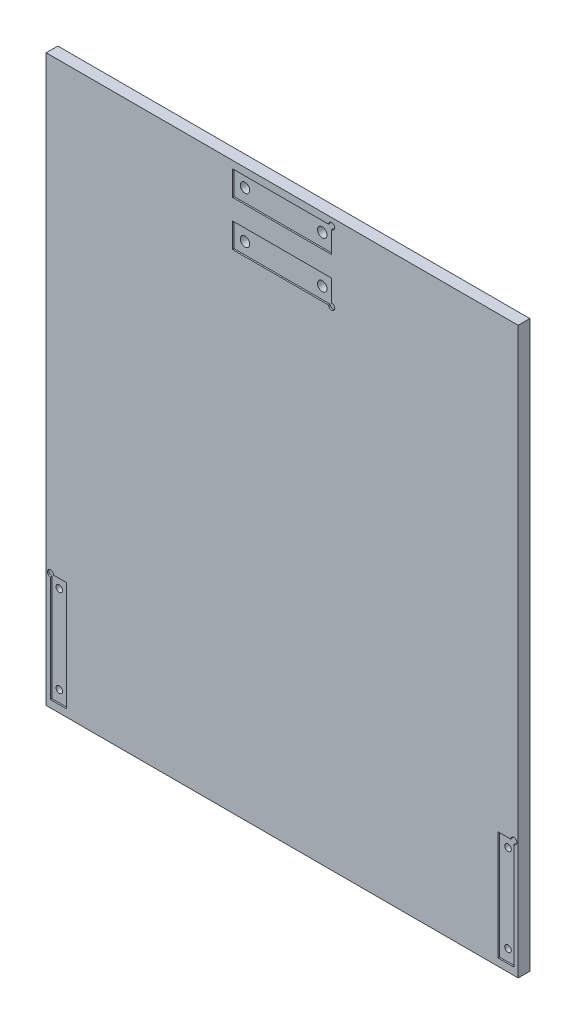
ISO-10303-21;
HEADER;
FILE_DESCRIPTION(('STEP AP214'),'2;1');
FILE_NAME('part.step','',(''),(''),'','','');
FILE_SCHEMA(('AUTOMOTIVE_DESIGN { 1 0 10303 214 1 1 1 1 }'));
ENDSEC;
DATA;
#1=APPLICATION_CONTEXT('core data for automotive mechanical design processes');
#2=APPLICATION_PROTOCOL_DEFINITION('international standard','automotive_design',2000,#1);
#3=PRODUCT_CONTEXT('',#1,'mechanical');
#4=PRODUCT('Part','Part','',(#3));
#5=PRODUCT_RELATED_PRODUCT_CATEGORY('part','',(#4));
#6=PRODUCT_DEFINITION_FORMATION('','',#4);
#7=PRODUCT_DEFINITION_CONTEXT('part definition',#1,'design');
#8=PRODUCT_DEFINITION('design','',#6,#7);
#9=PRODUCT_DEFINITION_SHAPE('','',#8);
#10=(LENGTH_UNIT() NAMED_UNIT(*) SI_UNIT(.MILLI.,.METRE.));
#11=(NAMED_UNIT(*) PLANE_ANGLE_UNIT() SI_UNIT($,.RADIAN.));
#12=(NAMED_UNIT(*) SI_UNIT($,.STERADIAN.) SOLID_ANGLE_UNIT());
#13=UNCERTAINTY_MEASURE_WITH_UNIT(LENGTH_MEASURE(1.E-05),#10,'distance_accuracy_value','');
#14=(GEOMETRIC_REPRESENTATION_CONTEXT(3) GLOBAL_UNCERTAINTY_ASSIGNED_CONTEXT((#13)) GLOBAL_UNIT_ASSIGNED_CONTEXT((#10,
#11,#12)) REPRESENTATION_CONTEXT('',''));
#15=CARTESIAN_POINT('',(0.,0.,0.));
#16=DIRECTION('',(0.,0.,1.));
#17=DIRECTION('',(1.,0.,0.));
#18=AXIS2_PLACEMENT_3D('',#15,#16,#17);
#19=CARTESIAN_POINT('',(0.,0.,8.));
#20=DIRECTION('',(0.,0.,1.));
#21=DIRECTION('',(1.,0.,0.));
#22=AXIS2_PLACEMENT_3D('',#19,#20,#21);
#23=PLANE('',#22);
#24=DIRECTION('',(0.,1.,0.));
#25=VECTOR('',#24,1.);
#26=CARTESIAN_POINT('',(34.,186.9,8.));
#27=LINE('',#26,#25);
#28=CARTESIAN_POINT('',(34.,172.,8.));
#29=VERTEX_POINT('',#28);
#30=CARTESIAN_POINT('',(34.,186.9,8.));
#31=VERTEX_POINT('',#30);
#32=EDGE_CURVE('E51',#29,#31,#27,.T.);
#33=ORIENTED_EDGE('',*,*,#32,.F.);
#34=DIRECTION('',(1.,0.,0.));
#35=VECTOR('',#34,1.);
#36=CARTESIAN_POINT('',(-34.,172.,8.));
#37=LINE('',#36,#35);
#38=CARTESIAN_POINT('',(-34.,172.,8.));
#39=VERTEX_POINT('',#38);
#40=EDGE_CURVE('E218',#39,#29,#37,.T.);
#41=ORIENTED_EDGE('',*,*,#40,.F.);
#42=DIRECTION('',(0.,-1.,0.));
#43=VECTOR('',#42,1.);
#44=CARTESIAN_POINT('',(-34.,189.,8.));
#45=LINE('',#44,#43);
#46=CARTESIAN_POINT('',(-34.,189.,8.));
#47=VERTEX_POINT('',#46);
#48=EDGE_CURVE('E221',#47,#39,#45,.T.);
#49=ORIENTED_EDGE('',*,*,#48,.F.);
#50=DIRECTION('',(-1.,0.,0.));
#51=VECTOR('',#50,1.);
#52=CARTESIAN_POINT('',(-34.,189.,8.));
#53=LINE('',#52,#51);
#54=CARTESIAN_POINT('',(31.9,189.,8.));
#55=VERTEX_POINT('',#54);
#56=EDGE_CURVE('E234',#55,#47,#53,.T.);
#57=ORIENTED_EDGE('',*,*,#56,.F.);
#58=CARTESIAN_POINT('',(34.,189.,8.));
#59=DIRECTION('',(0.,0.,1.));
#60=DIRECTION('',(-1.,0.,0.));
#61=AXIS2_PLACEMENT_3D('',#58,#59,#60);
#62=CIRCLE('',#61,2.09999999999999);
#63=EDGE_CURVE('E232',#31,#55,#62,.T.);
#64=ORIENTED_EDGE('',*,*,#63,.F.);
#65=EDGE_LOOP('',(#33,#41,#49,#57,#64));
#66=FACE_BOUND('',#65,.T.);
#67=DIRECTION('',(0.,-1.,0.));
#68=VECTOR('',#67,1.);
#69=CARTESIAN_POINT('',(-34.,141.,8.));
#70=LINE('',#69,#68);
#71=CARTESIAN_POINT('',(-34.,158.,8.));
#72=VERTEX_POINT('',#71);
#73=CARTESIAN_POINT('',(-34.,141.,8.));
#74=VERTEX_POINT('',#73);
#75=EDGE_CURVE('E59',#72,#74,#70,.T.);
#76=ORIENTED_EDGE('',*,*,#75,.F.);
#77=DIRECTION('',(-1.,0.,0.));
#78=VECTOR('',#77,1.);
#79=CARTESIAN_POINT('',(-34.,158.,8.));
#80=LINE('',#79,#78);
#81=CARTESIAN_POINT('',(34.,158.,8.));
#82=VERTEX_POINT('',#81);
#83=EDGE_CURVE('E259',#82,#72,#80,.T.);
#84=ORIENTED_EDGE('',*,*,#83,.F.);
#85=DIRECTION('',(0.,1.,0.));
#86=VECTOR('',#85,1.);
#87=CARTESIAN_POINT('',(34.,143.1,8.));
#88=LINE('',#87,#86);
#89=CARTESIAN_POINT('',(34.,143.1,8.));
#90=VERTEX_POINT('',#89);
#91=EDGE_CURVE('E262',#90,#82,#88,.T.);
#92=ORIENTED_EDGE('',*,*,#91,.F.);
#93=CARTESIAN_POINT('',(34.,141.,8.));
#94=DIRECTION('',(0.,0.,1.));
#95=DIRECTION('',(1.,0.,0.));
#96=AXIS2_PLACEMENT_3D('',#93,#94,#95);
#97=CIRCLE('',#96,2.09999999999999);
#98=CARTESIAN_POINT('',(31.9,141.,8.));
#99=VERTEX_POINT('',#98);
#100=EDGE_CURVE('E266',#99,#90,#97,.T.);
#101=ORIENTED_EDGE('',*,*,#100,.F.);
#102=DIRECTION('',(1.,0.,0.));
#103=VECTOR('',#102,1.);
#104=CARTESIAN_POINT('',(-34.,141.,8.));
#105=LINE('',#104,#103);
#106=EDGE_CURVE('E269',#74,#99,#105,.T.);
#107=ORIENTED_EDGE('',*,*,#106,.F.);
#108=EDGE_LOOP('',(#76,#84,#92,#101,#107));
#109=FACE_BOUND('',#108,.T.);
#110=DIRECTION('',(0.,1.,0.));
#111=VECTOR('',#110,1.);
#112=CARTESIAN_POINT('',(159.,-116.1,8.));
#113=LINE('',#112,#111);
#114=CARTESIAN_POINT('',(159.,-189.,8.));
#115=VERTEX_POINT('',#114);
#116=CARTESIAN_POINT('',(159.,-116.1,8.));
#117=VERTEX_POINT('',#116);
#118=EDGE_CURVE('E339',#115,#117,#113,.T.);
#119=ORIENTED_EDGE('',*,*,#118,.F.);
#120=DIRECTION('',(1.,0.,0.));
#121=VECTOR('',#120,1.);
#122=CARTESIAN_POINT('',(148.,-189.,8.));
#123=LINE('',#122,#121);
#124=CARTESIAN_POINT('',(148.,-189.,8.));
#125=VERTEX_POINT('',#124);
#126=EDGE_CURVE('E352',#125,#115,#123,.T.);
#127=ORIENTED_EDGE('',*,*,#126,.F.);
#128=DIRECTION('',(0.,-1.,0.));
#129=VECTOR('',#128,1.);
#130=CARTESIAN_POINT('',(148.,-114.,8.));
#131=LINE('',#130,#129);
#132=CARTESIAN_POINT('',(148.,-114.,8.));
#133=VERTEX_POINT('',#132);
#134=EDGE_CURVE('E372',#133,#125,#131,.T.);
#135=ORIENTED_EDGE('',*,*,#134,.F.);
#136=DIRECTION('',(-1.,0.,0.));
#137=VECTOR('',#136,1.);
#138=CARTESIAN_POINT('',(148.,-114.,8.));
#139=LINE('',#138,#137);
#140=CARTESIAN_POINT('',(156.9,-114.,8.));
#141=VERTEX_POINT('',#140);
#142=EDGE_CURVE('E369',#141,#133,#139,.T.);
#143=ORIENTED_EDGE('',*,*,#142,.F.);
#144=CARTESIAN_POINT('',(159.,-114.,8.));
#145=DIRECTION('',(0.,0.,1.));
#146=DIRECTION('',(-1.,0.,0.));
#147=AXIS2_PLACEMENT_3D('',#144,#145,#146);
#148=CIRCLE('',#147,2.1);
#149=EDGE_CURVE('E366',#117,#141,#148,.T.);
#150=ORIENTED_EDGE('',*,*,#149,.F.);
#151=EDGE_LOOP('',(#119,#127,#135,#143,#150));
#152=FACE_BOUND('',#151,.T.);
#153=DIRECTION('',(0.,1.,0.));
#154=VECTOR('',#153,1.);
#155=CARTESIAN_POINT('',(162.,194.,8.));
#156=LINE('',#155,#154);
#157=CARTESIAN_POINT('',(162.,-194.,8.));
#158=VERTEX_POINT('',#157);
#159=CARTESIAN_POINT('',(162.,194.,8.));
#160=VERTEX_POINT('',#159);
#161=EDGE_CURVE('E388',#158,#160,#156,.T.);
#162=ORIENTED_EDGE('',*,*,#161,.T.);
#163=DIRECTION('',(-1.,0.,0.));
#164=VECTOR('',#163,1.);
#165=CARTESIAN_POINT('',(-162.,194.,8.));
#166=LINE('',#165,#164);
#167=CARTESIAN_POINT('',(-162.,194.,8.));
#168=VERTEX_POINT('',#167);
#169=EDGE_CURVE('E391',#160,#168,#166,.T.);
#170=ORIENTED_EDGE('',*,*,#169,.T.);
#171=DIRECTION('',(0.,-1.,0.));
#172=VECTOR('',#171,1.);
#173=CARTESIAN_POINT('',(-162.,194.,8.));
#174=LINE('',#173,#172);
#175=CARTESIAN_POINT('',(-162.,-194.,8.));
#176=VERTEX_POINT('',#175);
#177=EDGE_CURVE('E394',#168,#176,#174,.T.);
#178=ORIENTED_EDGE('',*,*,#177,.T.);
#179=DIRECTION('',(1.,0.,0.));
#180=VECTOR('',#179,1.);
#181=CARTESIAN_POINT('',(-162.,-194.,8.));
#182=LINE('',#181,#180);
#183=EDGE_CURVE('E396',#176,#158,#182,.T.);
#184=ORIENTED_EDGE('',*,*,#183,.T.);
#185=EDGE_LOOP('',(#162,#170,#178,#184));
#186=FACE_BOUND('',#185,.T.);
#187=DIRECTION('',(-1.,0.,0.));
#188=VECTOR('',#187,1.);
#189=CARTESIAN_POINT('',(-148.,-189.,8.));
#190=LINE('',#189,#188);
#191=CARTESIAN_POINT('',(-148.,-189.,8.));
#192=VERTEX_POINT('',#191);
#193=CARTESIAN_POINT('',(-159.,-189.,8.));
#194=VERTEX_POINT('',#193);
#195=EDGE_CURVE('E325',#192,#194,#190,.T.);
#196=ORIENTED_EDGE('',*,*,#195,.T.);
#197=DIRECTION('',(0.,1.,0.));
#198=VECTOR('',#197,1.);
#199=CARTESIAN_POINT('',(-159.,-116.1,8.));
#200=LINE('',#199,#198);
#201=CARTESIAN_POINT('',(-159.,-116.1,8.));
#202=VERTEX_POINT('',#201);
#203=EDGE_CURVE('E301',#194,#202,#200,.T.);
#204=ORIENTED_EDGE('',*,*,#203,.T.);
#205=CARTESIAN_POINT('',(-159.,-114.,8.));
#206=DIRECTION('',(0.,0.,-1.));
#207=DIRECTION('',(1.,0.,0.));
#208=AXIS2_PLACEMENT_3D('',#205,#206,#207);
#209=CIRCLE('',#208,2.1);
#210=CARTESIAN_POINT('',(-156.9,-114.,8.));
#211=VERTEX_POINT('',#210);
#212=EDGE_CURVE('E314',#202,#211,#209,.T.);
#213=ORIENTED_EDGE('',*,*,#212,.T.);
#214=DIRECTION('',(1.,0.,0.));
#215=VECTOR('',#214,1.);
#216=CARTESIAN_POINT('',(-148.,-114.,8.));
#217=LINE('',#216,#215);
#218=CARTESIAN_POINT('',(-148.,-114.,8.));
#219=VERTEX_POINT('',#218);
#220=EDGE_CURVE('E331',#211,#219,#217,.T.);
#221=ORIENTED_EDGE('',*,*,#220,.T.);
#222=DIRECTION('',(0.,-1.,0.));
#223=VECTOR('',#222,1.);
#224=CARTESIAN_POINT('',(-148.,-114.,8.));
#225=LINE('',#224,#223);
#226=EDGE_CURVE('E328',#219,#192,#225,.T.);
#227=ORIENTED_EDGE('',*,*,#226,.T.);
#228=EDGE_LOOP('',(#196,#204,#213,#221,#227));
#229=FACE_BOUND('',#228,.T.);
#230=ADVANCED_FACE('F36',(#66,#109,#152,#186,#229),#23,.T.);
#231=CARTESIAN_POINT('',(162.,194.,8.));
#232=DIRECTION('',(-1.,0.,0.));
#233=DIRECTION('',(0.,-1.,0.));
#234=AXIS2_PLACEMENT_3D('',#231,#232,#233);
#235=PLANE('',#234);
#236=DIRECTION('',(0.,1.,0.));
#237=VECTOR('',#236,1.);
#238=CARTESIAN_POINT('',(162.,194.,0.));
#239=LINE('',#238,#237);
#240=CARTESIAN_POINT('',(162.,-194.,0.));
#241=VERTEX_POINT('',#240);
#242=CARTESIAN_POINT('',(162.,194.,0.));
#243=VERTEX_POINT('',#242);
#244=EDGE_CURVE('E379',#241,#243,#239,.T.);
#245=ORIENTED_EDGE('',*,*,#244,.T.);
#246=DIRECTION('',(0.,0.,-1.));
#247=VECTOR('',#246,1.);
#248=CARTESIAN_POINT('',(162.,194.,8.));
#249=LINE('',#248,#247);
#250=EDGE_CURVE('E11',#160,#243,#249,.T.);
#251=ORIENTED_EDGE('',*,*,#250,.F.);
#252=ORIENTED_EDGE('',*,*,#161,.F.);
#253=DIRECTION('',(0.,0.,-1.));
#254=VECTOR('',#253,1.);
#255=CARTESIAN_POINT('',(162.,-194.,8.));
#256=LINE('',#255,#254);
#257=EDGE_CURVE('E398',#158,#241,#256,.T.);
#258=ORIENTED_EDGE('',*,*,#257,.T.);
#259=EDGE_LOOP('',(#245,#251,#252,#258));
#260=FACE_BOUND('',#259,.T.);
#261=ADVANCED_FACE('F38',(#260),#235,.F.);
#262=CARTESIAN_POINT('',(-162.,194.,8.));
#263=DIRECTION('',(0.,-1.,0.));
#264=DIRECTION('',(0.,0.,-1.));
#265=AXIS2_PLACEMENT_3D('',#262,#263,#264);
#266=PLANE('',#265);
#267=DIRECTION('',(-1.,0.,0.));
#268=VECTOR('',#267,1.);
#269=CARTESIAN_POINT('',(-162.,194.,0.));
#270=LINE('',#269,#268);
#271=CARTESIAN_POINT('',(-162.,194.,0.));
#272=VERTEX_POINT('',#271);
#273=EDGE_CURVE('E401',#243,#272,#270,.T.);
#274=ORIENTED_EDGE('',*,*,#273,.T.);
#275=DIRECTION('',(0.,0.,-1.));
#276=VECTOR('',#275,1.);
#277=CARTESIAN_POINT('',(-162.,194.,8.));
#278=LINE('',#277,#276);
#279=EDGE_CURVE('E44',#168,#272,#278,.T.);
#280=ORIENTED_EDGE('',*,*,#279,.F.);
#281=ORIENTED_EDGE('',*,*,#169,.F.);
#282=ORIENTED_EDGE('',*,*,#250,.T.);
#283=EDGE_LOOP('',(#274,#280,#281,#282));
#284=FACE_BOUND('',#283,.T.);
#285=ADVANCED_FACE('F431',(#284),#266,.F.);
#286=CARTESIAN_POINT('',(-162.,194.,8.));
#287=DIRECTION('',(1.,0.,0.));
#288=DIRECTION('',(0.,1.,0.));
#289=AXIS2_PLACEMENT_3D('',#286,#287,#288);
#290=PLANE('',#289);
#291=DIRECTION('',(0.,-1.,0.));
#292=VECTOR('',#291,1.);
#293=CARTESIAN_POINT('',(-162.,194.,0.));
#294=LINE('',#293,#292);
#295=CARTESIAN_POINT('',(-162.,-194.,0.));
#296=VERTEX_POINT('',#295);
#297=EDGE_CURVE('E403',#272,#296,#294,.T.);
#298=ORIENTED_EDGE('',*,*,#297,.T.);
#299=DIRECTION('',(0.,0.,-1.));
#300=VECTOR('',#299,1.);
#301=CARTESIAN_POINT('',(-162.,-194.,8.));
#302=LINE('',#301,#300);
#303=EDGE_CURVE('E408',#176,#296,#302,.T.);
#304=ORIENTED_EDGE('',*,*,#303,.F.);
#305=ORIENTED_EDGE('',*,*,#177,.F.);
#306=ORIENTED_EDGE('',*,*,#279,.T.);
#307=EDGE_LOOP('',(#298,#304,#305,#306));
#308=FACE_BOUND('',#307,.T.);
#309=ADVANCED_FACE('F415',(#308),#290,.F.);
#310=CARTESIAN_POINT('',(-162.,-194.,8.));
#311=DIRECTION('',(0.,1.,0.));
#312=DIRECTION('',(0.,0.,1.));
#313=AXIS2_PLACEMENT_3D('',#310,#311,#312);
#314=PLANE('',#313);
#315=DIRECTION('',(1.,0.,0.));
#316=VECTOR('',#315,1.);
#317=CARTESIAN_POINT('',(-162.,-194.,0.));
#318=LINE('',#317,#316);
#319=EDGE_CURVE('E392',#296,#241,#318,.T.);
#320=ORIENTED_EDGE('',*,*,#319,.T.);
#321=ORIENTED_EDGE('',*,*,#257,.F.);
#322=ORIENTED_EDGE('',*,*,#183,.F.);
#323=ORIENTED_EDGE('',*,*,#303,.T.);
#324=EDGE_LOOP('',(#320,#321,#322,#323));
#325=FACE_BOUND('',#324,.T.);
#326=ADVANCED_FACE('F424',(#325),#314,.F.);
#327=CARTESIAN_POINT('',(0.,0.,0.));
#328=DIRECTION('',(0.,0.,1.));
#329=DIRECTION('',(1.,0.,0.));
#330=AXIS2_PLACEMENT_3D('',#327,#328,#329);
#331=PLANE('',#330);
#332=CARTESIAN_POINT('',(-26.5,149.,0.));
#333=DIRECTION('',(0.,0.,1.));
#334=DIRECTION('',(-1.,0.,0.));
#335=AXIS2_PLACEMENT_3D('',#332,#333,#334);
#336=CIRCLE('',#335,3.25);
#337=CARTESIAN_POINT('',(-29.75,149.,0.));
#338=VERTEX_POINT('',#337);
#339=EDGE_CURVE('E874',#338,#338,#336,.T.);
#340=ORIENTED_EDGE('',*,*,#339,.T.);
#341=EDGE_LOOP('',(#340));
#342=FACE_BOUND('',#341,.T.);
#343=CARTESIAN_POINT('',(26.5,149.,0.));
#344=DIRECTION('',(0.,0.,1.));
#345=DIRECTION('',(1.,0.,0.));
#346=AXIS2_PLACEMENT_3D('',#343,#344,#345);
#347=CIRCLE('',#346,3.24999999999998);
#348=CARTESIAN_POINT('',(29.75,149.,0.));
#349=VERTEX_POINT('',#348);
#350=EDGE_CURVE('E878',#349,#349,#347,.T.);
#351=ORIENTED_EDGE('',*,*,#350,.T.);
#352=EDGE_LOOP('',(#351));
#353=FACE_BOUND('',#352,.T.);
#354=CARTESIAN_POINT('',(26.5,181.,0.));
#355=DIRECTION('',(0.,0.,1.));
#356=DIRECTION('',(-1.,0.,0.));
#357=AXIS2_PLACEMENT_3D('',#354,#355,#356);
#358=CIRCLE('',#357,3.25);
#359=CARTESIAN_POINT('',(23.25,181.,0.));
#360=VERTEX_POINT('',#359);
#361=EDGE_CURVE('E893',#360,#360,#358,.T.);
#362=ORIENTED_EDGE('',*,*,#361,.T.);
#363=EDGE_LOOP('',(#362));
#364=FACE_BOUND('',#363,.T.);
#365=CARTESIAN_POINT('',(-26.5,181.,0.));
#366=DIRECTION('',(0.,0.,1.));
#367=DIRECTION('',(1.,0.,0.));
#368=AXIS2_PLACEMENT_3D('',#365,#366,#367);
#369=CIRCLE('',#368,3.25);
#370=CARTESIAN_POINT('',(-23.25,181.,0.));
#371=VERTEX_POINT('',#370);
#372=EDGE_CURVE('E258',#371,#371,#369,.T.);
#373=ORIENTED_EDGE('',*,*,#372,.T.);
#374=EDGE_LOOP('',(#373));
#375=FACE_BOUND('',#374,.T.);
#376=CARTESIAN_POINT('',(-154.,-121.,0.));
#377=DIRECTION('',(0.,0.,-1.));
#378=DIRECTION('',(-1.,0.,0.));
#379=AXIS2_PLACEMENT_3D('',#376,#377,#378);
#380=CIRCLE('',#379,2.25000000000001);
#381=CARTESIAN_POINT('',(-156.25,-121.,0.));
#382=VERTEX_POINT('',#381);
#383=EDGE_CURVE('E286',#382,#382,#380,.T.);
#384=ORIENTED_EDGE('',*,*,#383,.F.);
#385=EDGE_LOOP('',(#384));
#386=FACE_BOUND('',#385,.T.);
#387=CARTESIAN_POINT('',(-153.999999999998,-181.000000000001,0.));
#388=DIRECTION('',(0.,0.,-1.));
#389=DIRECTION('',(1.,0.,0.));
#390=AXIS2_PLACEMENT_3D('',#387,#388,#389);
#391=CIRCLE('',#390,2.25000000000254);
#392=CARTESIAN_POINT('',(-151.749999999995,-181.000000000001,0.));
#393=VERTEX_POINT('',#392);
#394=EDGE_CURVE('E293',#393,#393,#391,.T.);
#395=ORIENTED_EDGE('',*,*,#394,.F.);
#396=EDGE_LOOP('',(#395));
#397=FACE_BOUND('',#396,.T.);
#398=CARTESIAN_POINT('',(154.,-121.,0.));
#399=DIRECTION('',(0.,0.,1.));
#400=DIRECTION('',(1.,0.,0.));
#401=AXIS2_PLACEMENT_3D('',#398,#399,#400);
#402=CIRCLE('',#401,2.25000000000001);
#403=CARTESIAN_POINT('',(156.25,-121.,0.));
#404=VERTEX_POINT('',#403);
#405=EDGE_CURVE('E298',#404,#404,#402,.T.);
#406=ORIENTED_EDGE('',*,*,#405,.T.);
#407=EDGE_LOOP('',(#406));
#408=FACE_BOUND('',#407,.T.);
#409=CARTESIAN_POINT('',(153.999999999998,-181.000000000001,0.));
#410=DIRECTION('',(0.,0.,1.));
#411=DIRECTION('',(-1.,0.,0.));
#412=AXIS2_PLACEMENT_3D('',#409,#410,#411);
#413=CIRCLE('',#412,2.25000000000254);
#414=CARTESIAN_POINT('',(151.749999999995,-181.000000000001,0.));
#415=VERTEX_POINT('',#414);
#416=EDGE_CURVE('E289',#415,#415,#413,.T.);
#417=ORIENTED_EDGE('',*,*,#416,.T.);
#418=EDGE_LOOP('',(#417));
#419=FACE_BOUND('',#418,.T.);
#420=ORIENTED_EDGE('',*,*,#244,.F.);
#421=ORIENTED_EDGE('',*,*,#319,.F.);
#422=ORIENTED_EDGE('',*,*,#297,.F.);
#423=ORIENTED_EDGE('',*,*,#273,.F.);
#424=EDGE_LOOP('',(#420,#421,#422,#423));
#425=FACE_BOUND('',#424,.T.);
#426=ADVANCED_FACE('F421',(#342,#353,#364,#375,#386,#397,#408,#419,#425),#331,.F.);
#427=CARTESIAN_POINT('',(159.,-116.1,7.));
#428=DIRECTION('',(1.,0.,0.));
#429=DIRECTION('',(0.,1.,0.));
#430=AXIS2_PLACEMENT_3D('',#427,#428,#429);
#431=PLANE('',#430);
#432=ORIENTED_EDGE('',*,*,#118,.T.);
#433=DIRECTION('',(0.,0.,1.));
#434=VECTOR('',#433,1.);
#435=CARTESIAN_POINT('',(159.,-116.1,7.));
#436=LINE('',#435,#434);
#437=CARTESIAN_POINT('',(159.,-116.1,7.));
#438=VERTEX_POINT('',#437);
#439=EDGE_CURVE('E364',#438,#117,#436,.T.);
#440=ORIENTED_EDGE('',*,*,#439,.F.);
#441=DIRECTION('',(0.,1.,0.));
#442=VECTOR('',#441,1.);
#443=CARTESIAN_POINT('',(159.,-116.1,7.));
#444=LINE('',#443,#442);
#445=CARTESIAN_POINT('',(159.,-189.,7.));
#446=VERTEX_POINT('',#445);
#447=EDGE_CURVE('E348',#446,#438,#444,.T.);
#448=ORIENTED_EDGE('',*,*,#447,.F.);
#449=DIRECTION('',(0.,0.,1.));
#450=VECTOR('',#449,1.);
#451=CARTESIAN_POINT('',(159.,-189.,7.));
#452=LINE('',#451,#450);
#453=EDGE_CURVE('E377',#446,#115,#452,.T.);
#454=ORIENTED_EDGE('',*,*,#453,.T.);
#455=EDGE_LOOP('',(#432,#440,#448,#454));
#456=FACE_BOUND('',#455,.T.);
#457=ADVANCED_FACE('F446',(#456),#431,.F.);
#458=CARTESIAN_POINT('',(148.,-189.,7.));
#459=DIRECTION('',(0.,-1.,0.));
#460=DIRECTION('',(0.,0.,-1.));
#461=AXIS2_PLACEMENT_3D('',#458,#459,#460);
#462=PLANE('',#461);
#463=ORIENTED_EDGE('',*,*,#126,.T.);
#464=ORIENTED_EDGE('',*,*,#453,.F.);
#465=DIRECTION('',(1.,0.,0.));
#466=VECTOR('',#465,1.);
#467=CARTESIAN_POINT('',(148.,-189.,7.));
#468=LINE('',#467,#466);
#469=CARTESIAN_POINT('',(148.,-189.,7.));
#470=VERTEX_POINT('',#469);
#471=EDGE_CURVE('E361',#470,#446,#468,.T.);
#472=ORIENTED_EDGE('',*,*,#471,.F.);
#473=DIRECTION('',(0.,0.,1.));
#474=VECTOR('',#473,1.);
#475=CARTESIAN_POINT('',(148.,-189.,7.));
#476=LINE('',#475,#474);
#477=EDGE_CURVE('E380',#470,#125,#476,.T.);
#478=ORIENTED_EDGE('',*,*,#477,.T.);
#479=EDGE_LOOP('',(#463,#464,#472,#478));
#480=FACE_BOUND('',#479,.T.);
#481=ADVANCED_FACE('F468',(#480),#462,.F.);
#482=CARTESIAN_POINT('',(148.,-114.,7.));
#483=DIRECTION('',(-1.,0.,0.));
#484=DIRECTION('',(0.,0.,1.));
#485=AXIS2_PLACEMENT_3D('',#482,#483,#484);
#486=PLANE('',#485);
#487=ORIENTED_EDGE('',*,*,#134,.T.);
#488=ORIENTED_EDGE('',*,*,#477,.F.);
#489=DIRECTION('',(0.,-1.,0.));
#490=VECTOR('',#489,1.);
#491=CARTESIAN_POINT('',(148.,-114.,7.));
#492=LINE('',#491,#490);
#493=CARTESIAN_POINT('',(148.,-114.,7.));
#494=VERTEX_POINT('',#493);
#495=EDGE_CURVE('E358',#494,#470,#492,.T.);
#496=ORIENTED_EDGE('',*,*,#495,.F.);
#497=DIRECTION('',(0.,0.,1.));
#498=VECTOR('',#497,1.);
#499=CARTESIAN_POINT('',(148.,-114.,7.));
#500=LINE('',#499,#498);
#501=EDGE_CURVE('E382',#494,#133,#500,.T.);
#502=ORIENTED_EDGE('',*,*,#501,.T.);
#503=EDGE_LOOP('',(#487,#488,#496,#502));
#504=FACE_BOUND('',#503,.T.);
#505=ADVANCED_FACE('F475',(#504),#486,.F.);
#506=CARTESIAN_POINT('',(148.,-114.,7.));
#507=DIRECTION('',(0.,1.,0.));
#508=DIRECTION('',(0.,0.,1.));
#509=AXIS2_PLACEMENT_3D('',#506,#507,#508);
#510=PLANE('',#509);
#511=ORIENTED_EDGE('',*,*,#142,.T.);
#512=ORIENTED_EDGE('',*,*,#501,.F.);
#513=DIRECTION('',(-1.,0.,0.));
#514=VECTOR('',#513,1.);
#515=CARTESIAN_POINT('',(148.,-114.,7.));
#516=LINE('',#515,#514);
#517=CARTESIAN_POINT('',(156.9,-114.,7.));
#518=VERTEX_POINT('',#517);
#519=EDGE_CURVE('E355',#518,#494,#516,.T.);
#520=ORIENTED_EDGE('',*,*,#519,.F.);
#521=DIRECTION('',(0.,0.,1.));
#522=VECTOR('',#521,1.);
#523=CARTESIAN_POINT('',(156.9,-114.,7.));
#524=LINE('',#523,#522);
#525=EDGE_CURVE('E384',#518,#141,#524,.T.);
#526=ORIENTED_EDGE('',*,*,#525,.T.);
#527=EDGE_LOOP('',(#511,#512,#520,#526));
#528=FACE_BOUND('',#527,.T.);
#529=ADVANCED_FACE('F483',(#528),#510,.F.);
#530=CARTESIAN_POINT('',(159.,-114.,7.));
#531=DIRECTION('',(0.,0.,1.));
#532=DIRECTION('',(1.,0.,0.));
#533=AXIS2_PLACEMENT_3D('',#530,#531,#532);
#534=CYLINDRICAL_SURFACE('',#533,2.1);
#535=ORIENTED_EDGE('',*,*,#149,.T.);
#536=ORIENTED_EDGE('',*,*,#525,.F.);
#537=CARTESIAN_POINT('',(159.,-114.,7.));
#538=DIRECTION('',(0.,0.,1.));
#539=DIRECTION('',(-1.,0.,0.));
#540=AXIS2_PLACEMENT_3D('',#537,#538,#539);
#541=CIRCLE('',#540,2.1);
#542=EDGE_CURVE('E351',#438,#518,#541,.T.);
#543=ORIENTED_EDGE('',*,*,#542,.F.);
#544=ORIENTED_EDGE('',*,*,#439,.T.);
#545=EDGE_LOOP('',(#535,#536,#543,#544));
#546=FACE_BOUND('',#545,.T.);
#547=ADVANCED_FACE('F491',(#546),#534,.F.);
#548=CARTESIAN_POINT('',(159.,-114.,7.));
#549=DIRECTION('',(0.,0.,-1.));
#550=DIRECTION('',(-1.,0.,0.));
#551=AXIS2_PLACEMENT_3D('',#548,#549,#550);
#552=PLANE('',#551);
#553=CARTESIAN_POINT('',(154.,-121.,7.));
#554=DIRECTION('',(0.,0.,1.));
#555=DIRECTION('',(1.,0.,0.));
#556=AXIS2_PLACEMENT_3D('',#553,#554,#555);
#557=CIRCLE('',#556,2.25000000000001);
#558=CARTESIAN_POINT('',(156.25,-121.,7.));
#559=VERTEX_POINT('',#558);
#560=EDGE_CURVE('E302',#559,#559,#557,.T.);
#561=ORIENTED_EDGE('',*,*,#560,.F.);
#562=EDGE_LOOP('',(#561));
#563=FACE_BOUND('',#562,.T.);
#564=CARTESIAN_POINT('',(153.999999999998,-181.000000000001,7.));
#565=DIRECTION('',(0.,0.,1.));
#566=DIRECTION('',(-1.,0.,0.));
#567=AXIS2_PLACEMENT_3D('',#564,#565,#566);
#568=CIRCLE('',#567,2.25000000000254);
#569=CARTESIAN_POINT('',(151.749999999995,-181.000000000001,7.));
#570=VERTEX_POINT('',#569);
#571=EDGE_CURVE('E305',#570,#570,#568,.T.);
#572=ORIENTED_EDGE('',*,*,#571,.F.);
#573=EDGE_LOOP('',(#572));
#574=FACE_BOUND('',#573,.T.);
#575=ORIENTED_EDGE('',*,*,#447,.T.);
#576=ORIENTED_EDGE('',*,*,#542,.T.);
#577=ORIENTED_EDGE('',*,*,#519,.T.);
#578=ORIENTED_EDGE('',*,*,#495,.T.);
#579=ORIENTED_EDGE('',*,*,#471,.T.);
#580=EDGE_LOOP('',(#575,#576,#577,#578,#579));
#581=FACE_BOUND('',#580,.T.);
#582=ADVANCED_FACE('F499',(#563,#574,#581),#552,.F.);
#583=CARTESIAN_POINT('',(-159.,-116.1,7.));
#584=DIRECTION('',(1.,0.,0.));
#585=DIRECTION('',(0.,1.,0.));
#586=AXIS2_PLACEMENT_3D('',#583,#584,#585);
#587=PLANE('',#586);
#588=ORIENTED_EDGE('',*,*,#203,.F.);
#589=DIRECTION('',(0.,0.,1.));
#590=VECTOR('',#589,1.);
#591=CARTESIAN_POINT('',(-159.,-189.,7.));
#592=LINE('',#591,#590);
#593=CARTESIAN_POINT('',(-159.,-189.,7.));
#594=VERTEX_POINT('',#593);
#595=EDGE_CURVE('E322',#594,#194,#592,.T.);
#596=ORIENTED_EDGE('',*,*,#595,.F.);
#597=DIRECTION('',(0.,1.,0.));
#598=VECTOR('',#597,1.);
#599=CARTESIAN_POINT('',(-159.,-116.1,7.));
#600=LINE('',#599,#598);
#601=CARTESIAN_POINT('',(-159.,-116.1,7.));
#602=VERTEX_POINT('',#601);
#603=EDGE_CURVE('E310',#594,#602,#600,.T.);
#604=ORIENTED_EDGE('',*,*,#603,.T.);
#605=DIRECTION('',(0.,0.,1.));
#606=VECTOR('',#605,1.);
#607=CARTESIAN_POINT('',(-159.,-116.1,7.));
#608=LINE('',#607,#606);
#609=EDGE_CURVE('E336',#602,#202,#608,.T.);
#610=ORIENTED_EDGE('',*,*,#609,.T.);
#611=EDGE_LOOP('',(#588,#596,#604,#610));
#612=FACE_BOUND('',#611,.T.);
#613=ADVANCED_FACE('F507',(#612),#587,.T.);
#614=CARTESIAN_POINT('',(-159.,-114.,7.));
#615=DIRECTION('',(0.,0.,1.));
#616=DIRECTION('',(1.,0.,0.));
#617=AXIS2_PLACEMENT_3D('',#614,#615,#616);
#618=CYLINDRICAL_SURFACE('',#617,2.1);
#619=ORIENTED_EDGE('',*,*,#212,.F.);
#620=ORIENTED_EDGE('',*,*,#609,.F.);
#621=CARTESIAN_POINT('',(-159.,-114.,7.));
#622=DIRECTION('',(0.,0.,-1.));
#623=DIRECTION('',(1.,0.,0.));
#624=AXIS2_PLACEMENT_3D('',#621,#622,#623);
#625=CIRCLE('',#624,2.1);
#626=CARTESIAN_POINT('',(-156.9,-114.,7.));
#627=VERTEX_POINT('',#626);
#628=EDGE_CURVE('E320',#602,#627,#625,.T.);
#629=ORIENTED_EDGE('',*,*,#628,.T.);
#630=DIRECTION('',(0.,0.,1.));
#631=VECTOR('',#630,1.);
#632=CARTESIAN_POINT('',(-156.9,-114.,7.));
#633=LINE('',#632,#631);
#634=EDGE_CURVE('E340',#627,#211,#633,.T.);
#635=ORIENTED_EDGE('',*,*,#634,.T.);
#636=EDGE_LOOP('',(#619,#620,#629,#635));
#637=FACE_BOUND('',#636,.T.);
#638=ADVANCED_FACE('F516',(#637),#618,.F.);
#639=CARTESIAN_POINT('',(-148.,-114.,7.));
#640=DIRECTION('',(0.,-1.,0.));
#641=DIRECTION('',(0.,0.,-1.));
#642=AXIS2_PLACEMENT_3D('',#639,#640,#641);
#643=PLANE('',#642);
#644=ORIENTED_EDGE('',*,*,#220,.F.);
#645=ORIENTED_EDGE('',*,*,#634,.F.);
#646=DIRECTION('',(1.,0.,0.));
#647=VECTOR('',#646,1.);
#648=CARTESIAN_POINT('',(-148.,-114.,7.));
#649=LINE('',#648,#647);
#650=CARTESIAN_POINT('',(-148.,-114.,7.));
#651=VERTEX_POINT('',#650);
#652=EDGE_CURVE('E318',#627,#651,#649,.T.);
#653=ORIENTED_EDGE('',*,*,#652,.T.);
#654=DIRECTION('',(0.,0.,1.));
#655=VECTOR('',#654,1.);
#656=CARTESIAN_POINT('',(-148.,-114.,7.));
#657=LINE('',#656,#655);
#658=EDGE_CURVE('E342',#651,#219,#657,.T.);
#659=ORIENTED_EDGE('',*,*,#658,.T.);
#660=EDGE_LOOP('',(#644,#645,#653,#659));
#661=FACE_BOUND('',#660,.T.);
#662=ADVANCED_FACE('F524',(#661),#643,.T.);
#663=CARTESIAN_POINT('',(-148.,-114.,7.));
#664=DIRECTION('',(-1.,0.,0.));
#665=DIRECTION('',(0.,0.,1.));
#666=AXIS2_PLACEMENT_3D('',#663,#664,#665);
#667=PLANE('',#666);
#668=ORIENTED_EDGE('',*,*,#226,.F.);
#669=ORIENTED_EDGE('',*,*,#658,.F.);
#670=DIRECTION('',(0.,-1.,0.));
#671=VECTOR('',#670,1.);
#672=CARTESIAN_POINT('',(-148.,-114.,7.));
#673=LINE('',#672,#671);
#674=CARTESIAN_POINT('',(-148.,-189.,7.));
#675=VERTEX_POINT('',#674);
#676=EDGE_CURVE('E316',#651,#675,#673,.T.);
#677=ORIENTED_EDGE('',*,*,#676,.T.);
#678=DIRECTION('',(0.,0.,1.));
#679=VECTOR('',#678,1.);
#680=CARTESIAN_POINT('',(-148.,-189.,7.));
#681=LINE('',#680,#679);
#682=EDGE_CURVE('E344',#675,#192,#681,.T.);
#683=ORIENTED_EDGE('',*,*,#682,.T.);
#684=EDGE_LOOP('',(#668,#669,#677,#683));
#685=FACE_BOUND('',#684,.T.);
#686=ADVANCED_FACE('F532',(#685),#667,.T.);
#687=CARTESIAN_POINT('',(-148.,-189.,7.));
#688=DIRECTION('',(0.,1.,0.));
#689=DIRECTION('',(0.,0.,1.));
#690=AXIS2_PLACEMENT_3D('',#687,#688,#689);
#691=PLANE('',#690);
#692=ORIENTED_EDGE('',*,*,#195,.F.);
#693=ORIENTED_EDGE('',*,*,#682,.F.);
#694=DIRECTION('',(-1.,0.,0.));
#695=VECTOR('',#694,1.);
#696=CARTESIAN_POINT('',(-148.,-189.,7.));
#697=LINE('',#696,#695);
#698=EDGE_CURVE('E313',#675,#594,#697,.T.);
#699=ORIENTED_EDGE('',*,*,#698,.T.);
#700=ORIENTED_EDGE('',*,*,#595,.T.);
#701=EDGE_LOOP('',(#692,#693,#699,#700));
#702=FACE_BOUND('',#701,.T.);
#703=ADVANCED_FACE('F540',(#702),#691,.T.);
#704=CARTESIAN_POINT('',(-159.,-114.,7.));
#705=DIRECTION('',(0.,0.,-1.));
#706=DIRECTION('',(1.,0.,0.));
#707=AXIS2_PLACEMENT_3D('',#704,#705,#706);
#708=PLANE('',#707);
#709=CARTESIAN_POINT('',(-154.,-121.,7.));
#710=DIRECTION('',(0.,0.,-1.));
#711=DIRECTION('',(-1.,0.,0.));
#712=AXIS2_PLACEMENT_3D('',#709,#710,#711);
#713=CIRCLE('',#712,2.25000000000001);
#714=CARTESIAN_POINT('',(-156.25,-121.,7.));
#715=VERTEX_POINT('',#714);
#716=EDGE_CURVE('E290',#715,#715,#713,.T.);
#717=ORIENTED_EDGE('',*,*,#716,.T.);
#718=EDGE_LOOP('',(#717));
#719=FACE_BOUND('',#718,.T.);
#720=CARTESIAN_POINT('',(-153.999999999998,-181.000000000001,7.));
#721=DIRECTION('',(0.,0.,-1.));
#722=DIRECTION('',(1.,0.,0.));
#723=AXIS2_PLACEMENT_3D('',#720,#721,#722);
#724=CIRCLE('',#723,2.25000000000254);
#725=CARTESIAN_POINT('',(-151.749999999995,-181.000000000001,7.));
#726=VERTEX_POINT('',#725);
#727=EDGE_CURVE('E241',#726,#726,#724,.T.);
#728=ORIENTED_EDGE('',*,*,#727,.T.);
#729=EDGE_LOOP('',(#728));
#730=FACE_BOUND('',#729,.T.);
#731=ORIENTED_EDGE('',*,*,#603,.F.);
#732=ORIENTED_EDGE('',*,*,#698,.F.);
#733=ORIENTED_EDGE('',*,*,#676,.F.);
#734=ORIENTED_EDGE('',*,*,#652,.F.);
#735=ORIENTED_EDGE('',*,*,#628,.F.);
#736=EDGE_LOOP('',(#731,#732,#733,#734,#735));
#737=FACE_BOUND('',#736,.T.);
#738=ADVANCED_FACE('F547',(#719,#730,#737),#708,.F.);
#739=CARTESIAN_POINT('',(153.999999999998,-181.000000000001,0.));
#740=DIRECTION('',(0.,0.,1.));
#741=DIRECTION('',(1.,0.,0.));
#742=AXIS2_PLACEMENT_3D('',#739,#740,#741);
#743=CYLINDRICAL_SURFACE('',#742,2.25000000000254);
#744=ORIENTED_EDGE('',*,*,#416,.F.);
#745=EDGE_LOOP('',(#744));
#746=FACE_BOUND('',#745,.T.);
#747=ORIENTED_EDGE('',*,*,#571,.T.);
#748=EDGE_LOOP('',(#747));
#749=FACE_BOUND('',#748,.T.);
#750=ADVANCED_FACE('F555',(#746,#749),#743,.F.);
#751=CARTESIAN_POINT('',(154.,-121.,0.));
#752=DIRECTION('',(0.,0.,1.));
#753=DIRECTION('',(1.,0.,0.));
#754=AXIS2_PLACEMENT_3D('',#751,#752,#753);
#755=CYLINDRICAL_SURFACE('',#754,2.25000000000001);
#756=ORIENTED_EDGE('',*,*,#405,.F.);
#757=EDGE_LOOP('',(#756));
#758=FACE_BOUND('',#757,.T.);
#759=ORIENTED_EDGE('',*,*,#560,.T.);
#760=EDGE_LOOP('',(#759));
#761=FACE_BOUND('',#760,.T.);
#762=ADVANCED_FACE('F564',(#758,#761),#755,.F.);
#763=CARTESIAN_POINT('',(-153.999999999998,-181.000000000001,0.));
#764=DIRECTION('',(0.,0.,1.));
#765=DIRECTION('',(1.,0.,0.));
#766=AXIS2_PLACEMENT_3D('',#763,#764,#765);
#767=CYLINDRICAL_SURFACE('',#766,2.25000000000254);
#768=ORIENTED_EDGE('',*,*,#394,.T.);
#769=EDGE_LOOP('',(#768));
#770=FACE_BOUND('',#769,.T.);
#771=ORIENTED_EDGE('',*,*,#727,.F.);
#772=EDGE_LOOP('',(#771));
#773=FACE_BOUND('',#772,.T.);
#774=ADVANCED_FACE('F571',(#770,#773),#767,.F.);
#775=CARTESIAN_POINT('',(-154.,-121.,0.));
#776=DIRECTION('',(0.,0.,1.));
#777=DIRECTION('',(1.,0.,0.));
#778=AXIS2_PLACEMENT_3D('',#775,#776,#777);
#779=CYLINDRICAL_SURFACE('',#778,2.25000000000001);
#780=ORIENTED_EDGE('',*,*,#383,.T.);
#781=EDGE_LOOP('',(#780));
#782=FACE_BOUND('',#781,.T.);
#783=ORIENTED_EDGE('',*,*,#716,.F.);
#784=EDGE_LOOP('',(#783));
#785=FACE_BOUND('',#784,.T.);
#786=ADVANCED_FACE('F578',(#782,#785),#779,.F.);
#787=CARTESIAN_POINT('',(-34.,141.,7.));
#788=DIRECTION('',(-1.,0.,0.));
#789=DIRECTION('',(0.,0.,1.));
#790=AXIS2_PLACEMENT_3D('',#787,#788,#789);
#791=PLANE('',#790);
#792=ORIENTED_EDGE('',*,*,#75,.T.);
#793=DIRECTION('',(0.,0.,1.));
#794=VECTOR('',#793,1.);
#795=CARTESIAN_POINT('',(-34.,141.,7.));
#796=LINE('',#795,#794);
#797=CARTESIAN_POINT('',(-34.,141.,7.));
#798=VERTEX_POINT('',#797);
#799=EDGE_CURVE('E247',#798,#74,#796,.T.);
#800=ORIENTED_EDGE('',*,*,#799,.F.);
#801=DIRECTION('',(0.,-1.,0.));
#802=VECTOR('',#801,1.);
#803=CARTESIAN_POINT('',(-34.,141.,7.));
#804=LINE('',#803,#802);
#805=CARTESIAN_POINT('',(-34.,158.,7.));
#806=VERTEX_POINT('',#805);
#807=EDGE_CURVE('E263',#806,#798,#804,.T.);
#808=ORIENTED_EDGE('',*,*,#807,.F.);
#809=DIRECTION('',(0.,0.,1.));
#810=VECTOR('',#809,1.);
#811=CARTESIAN_POINT('',(-34.,158.,7.));
#812=LINE('',#811,#810);
#813=EDGE_CURVE('E256',#806,#72,#812,.T.);
#814=ORIENTED_EDGE('',*,*,#813,.T.);
#815=EDGE_LOOP('',(#792,#800,#808,#814));
#816=FACE_BOUND('',#815,.T.);
#817=ADVANCED_FACE('F586',(#816),#791,.F.);
#818=CARTESIAN_POINT('',(-34.,158.,7.));
#819=DIRECTION('',(0.,1.,0.));
#820=DIRECTION('',(0.,0.,1.));
#821=AXIS2_PLACEMENT_3D('',#818,#819,#820);
#822=PLANE('',#821);
#823=ORIENTED_EDGE('',*,*,#83,.T.);
#824=ORIENTED_EDGE('',*,*,#813,.F.);
#825=DIRECTION('',(-1.,0.,0.));
#826=VECTOR('',#825,1.);
#827=CARTESIAN_POINT('',(-34.,158.,7.));
#828=LINE('',#827,#826);
#829=CARTESIAN_POINT('',(34.,158.,7.));
#830=VERTEX_POINT('',#829);
#831=EDGE_CURVE('E249',#830,#806,#828,.T.);
#832=ORIENTED_EDGE('',*,*,#831,.F.);
#833=DIRECTION('',(0.,0.,1.));
#834=VECTOR('',#833,1.);
#835=CARTESIAN_POINT('',(34.,158.,7.));
#836=LINE('',#835,#834);
#837=EDGE_CURVE('E254',#830,#82,#836,.T.);
#838=ORIENTED_EDGE('',*,*,#837,.T.);
#839=EDGE_LOOP('',(#823,#824,#832,#838));
#840=FACE_BOUND('',#839,.T.);
#841=ADVANCED_FACE('F594',(#840),#822,.F.);
#842=CARTESIAN_POINT('',(34.,143.1,7.));
#843=DIRECTION('',(1.,0.,0.));
#844=DIRECTION('',(0.,0.,-1.));
#845=AXIS2_PLACEMENT_3D('',#842,#843,#844);
#846=PLANE('',#845);
#847=ORIENTED_EDGE('',*,*,#91,.T.);
#848=ORIENTED_EDGE('',*,*,#837,.F.);
#849=DIRECTION('',(0.,1.,0.));
#850=VECTOR('',#849,1.);
#851=CARTESIAN_POINT('',(34.,143.1,7.));
#852=LINE('',#851,#850);
#853=CARTESIAN_POINT('',(34.,143.1,7.));
#854=VERTEX_POINT('',#853);
#855=EDGE_CURVE('E275',#854,#830,#852,.T.);
#856=ORIENTED_EDGE('',*,*,#855,.F.);
#857=DIRECTION('',(0.,0.,1.));
#858=VECTOR('',#857,1.);
#859=CARTESIAN_POINT('',(34.,143.1,7.));
#860=LINE('',#859,#858);
#861=EDGE_CURVE('E252',#854,#90,#860,.T.);
#862=ORIENTED_EDGE('',*,*,#861,.T.);
#863=EDGE_LOOP('',(#847,#848,#856,#862));
#864=FACE_BOUND('',#863,.T.);
#865=ADVANCED_FACE('F601',(#864),#846,.F.);
#866=CARTESIAN_POINT('',(34.,141.,7.));
#867=DIRECTION('',(0.,0.,1.));
#868=DIRECTION('',(1.,0.,0.));
#869=AXIS2_PLACEMENT_3D('',#866,#867,#868);
#870=CYLINDRICAL_SURFACE('',#869,2.09999999999999);
#871=ORIENTED_EDGE('',*,*,#100,.T.);
#872=ORIENTED_EDGE('',*,*,#861,.F.);
#873=CARTESIAN_POINT('',(34.,141.,7.));
#874=DIRECTION('',(0.,0.,1.));
#875=DIRECTION('',(1.,0.,0.));
#876=AXIS2_PLACEMENT_3D('',#873,#874,#875);
#877=CIRCLE('',#876,2.09999999999999);
#878=CARTESIAN_POINT('',(31.9,141.,7.));
#879=VERTEX_POINT('',#878);
#880=EDGE_CURVE('E278',#879,#854,#877,.T.);
#881=ORIENTED_EDGE('',*,*,#880,.F.);
#882=DIRECTION('',(0.,0.,1.));
#883=VECTOR('',#882,1.);
#884=CARTESIAN_POINT('',(31.9,141.,7.));
#885=LINE('',#884,#883);
#886=EDGE_CURVE('E250',#879,#99,#885,.T.);
#887=ORIENTED_EDGE('',*,*,#886,.T.);
#888=EDGE_LOOP('',(#871,#872,#881,#887));
#889=FACE_BOUND('',#888,.T.);
#890=ADVANCED_FACE('F609',(#889),#870,.F.);
#891=CARTESIAN_POINT('',(-34.,141.,7.));
#892=DIRECTION('',(0.,-1.,0.));
#893=DIRECTION('',(1.,0.,0.));
#894=AXIS2_PLACEMENT_3D('',#891,#892,#893);
#895=PLANE('',#894);
#896=ORIENTED_EDGE('',*,*,#106,.T.);
#897=ORIENTED_EDGE('',*,*,#886,.F.);
#898=DIRECTION('',(1.,0.,0.));
#899=VECTOR('',#898,1.);
#900=CARTESIAN_POINT('',(-34.,141.,7.));
#901=LINE('',#900,#899);
#902=EDGE_CURVE('E281',#798,#879,#901,.T.);
#903=ORIENTED_EDGE('',*,*,#902,.F.);
#904=ORIENTED_EDGE('',*,*,#799,.T.);
#905=EDGE_LOOP('',(#896,#897,#903,#904));
#906=FACE_BOUND('',#905,.T.);
#907=ADVANCED_FACE('F617',(#906),#895,.F.);
#908=CARTESIAN_POINT('',(34.,141.,7.));
#909=DIRECTION('',(0.,0.,1.));
#910=DIRECTION('',(1.,0.,0.));
#911=AXIS2_PLACEMENT_3D('',#908,#909,#910);
#912=PLANE('',#911);
#913=CARTESIAN_POINT('',(-26.5,149.,7.));
#914=DIRECTION('',(0.,0.,1.));
#915=DIRECTION('',(-1.,0.,0.));
#916=AXIS2_PLACEMENT_3D('',#913,#914,#915);
#917=CIRCLE('',#916,3.25);
#918=CARTESIAN_POINT('',(-29.75,149.,7.));
#919=VERTEX_POINT('',#918);
#920=EDGE_CURVE('E877',#919,#919,#917,.T.);
#921=ORIENTED_EDGE('',*,*,#920,.F.);
#922=EDGE_LOOP('',(#921));
#923=FACE_BOUND('',#922,.T.);
#924=CARTESIAN_POINT('',(26.5,149.,7.));
#925=DIRECTION('',(0.,0.,1.));
#926=DIRECTION('',(1.,0.,0.));
#927=AXIS2_PLACEMENT_3D('',#924,#925,#926);
#928=CIRCLE('',#927,3.24999999999998);
#929=CARTESIAN_POINT('',(29.75,149.,7.));
#930=VERTEX_POINT('',#929);
#931=EDGE_CURVE('E881',#930,#930,#928,.T.);
#932=ORIENTED_EDGE('',*,*,#931,.F.);
#933=EDGE_LOOP('',(#932));
#934=FACE_BOUND('',#933,.T.);
#935=ORIENTED_EDGE('',*,*,#807,.T.);
#936=ORIENTED_EDGE('',*,*,#902,.T.);
#937=ORIENTED_EDGE('',*,*,#880,.T.);
#938=ORIENTED_EDGE('',*,*,#855,.T.);
#939=ORIENTED_EDGE('',*,*,#831,.T.);
#940=EDGE_LOOP('',(#935,#936,#937,#938,#939));
#941=FACE_BOUND('',#940,.T.);
#942=ADVANCED_FACE('F625',(#923,#934,#941),#912,.T.);
#943=CARTESIAN_POINT('',(34.,186.9,7.));
#944=DIRECTION('',(1.,0.,0.));
#945=DIRECTION('',(0.,0.,-1.));
#946=AXIS2_PLACEMENT_3D('',#943,#944,#945);
#947=PLANE('',#946);
#948=ORIENTED_EDGE('',*,*,#32,.T.);
#949=DIRECTION('',(0.,0.,1.));
#950=VECTOR('',#949,1.);
#951=CARTESIAN_POINT('',(34.,186.9,7.));
#952=LINE('',#951,#950);
#953=CARTESIAN_POINT('',(34.,186.9,7.));
#954=VERTEX_POINT('',#953);
#955=EDGE_CURVE('E195',#954,#31,#952,.T.);
#956=ORIENTED_EDGE('',*,*,#955,.F.);
#957=DIRECTION('',(0.,1.,0.));
#958=VECTOR('',#957,1.);
#959=CARTESIAN_POINT('',(34.,186.9,7.));
#960=LINE('',#959,#958);
#961=CARTESIAN_POINT('',(34.,172.,7.));
#962=VERTEX_POINT('',#961);
#963=EDGE_CURVE('E199',#962,#954,#960,.T.);
#964=ORIENTED_EDGE('',*,*,#963,.F.);
#965=DIRECTION('',(0.,0.,1.));
#966=VECTOR('',#965,1.);
#967=CARTESIAN_POINT('',(34.,172.,7.));
#968=LINE('',#967,#966);
#969=EDGE_CURVE('E239',#962,#29,#968,.T.);
#970=ORIENTED_EDGE('',*,*,#969,.T.);
#971=EDGE_LOOP('',(#948,#956,#964,#970));
#972=FACE_BOUND('',#971,.T.);
#973=ADVANCED_FACE('F197',(#972),#947,.F.);
#974=CARTESIAN_POINT('',(-34.,172.,7.));
#975=DIRECTION('',(0.,-1.,0.));
#976=DIRECTION('',(0.,0.,-1.));
#977=AXIS2_PLACEMENT_3D('',#974,#975,#976);
#978=PLANE('',#977);
#979=ORIENTED_EDGE('',*,*,#40,.T.);
#980=ORIENTED_EDGE('',*,*,#969,.F.);
#981=DIRECTION('',(1.,0.,0.));
#982=VECTOR('',#981,1.);
#983=CARTESIAN_POINT('',(-34.,172.,7.));
#984=LINE('',#983,#982);
#985=CARTESIAN_POINT('',(-34.,172.,7.));
#986=VERTEX_POINT('',#985);
#987=EDGE_CURVE('E205',#986,#962,#984,.T.);
#988=ORIENTED_EDGE('',*,*,#987,.F.);
#989=DIRECTION('',(0.,0.,1.));
#990=VECTOR('',#989,1.);
#991=CARTESIAN_POINT('',(-34.,172.,7.));
#992=LINE('',#991,#990);
#993=EDGE_CURVE('E242',#986,#39,#992,.T.);
#994=ORIENTED_EDGE('',*,*,#993,.T.);
#995=EDGE_LOOP('',(#979,#980,#988,#994));
#996=FACE_BOUND('',#995,.T.);
#997=ADVANCED_FACE('F640',(#996),#978,.F.);
#998=CARTESIAN_POINT('',(-34.,189.,7.));
#999=DIRECTION('',(-1.,0.,0.));
#1000=DIRECTION('',(0.,0.,1.));
#1001=AXIS2_PLACEMENT_3D('',#998,#999,#1000);
#1002=PLANE('',#1001);
#1003=ORIENTED_EDGE('',*,*,#48,.T.);
#1004=ORIENTED_EDGE('',*,*,#993,.F.);
#1005=DIRECTION('',(0.,-1.,0.));
#1006=VECTOR('',#1005,1.);
#1007=CARTESIAN_POINT('',(-34.,189.,7.));
#1008=LINE('',#1007,#1006);
#1009=CARTESIAN_POINT('',(-34.,189.,7.));
#1010=VERTEX_POINT('',#1009);
#1011=EDGE_CURVE('E228',#1010,#986,#1008,.T.);
#1012=ORIENTED_EDGE('',*,*,#1011,.F.);
#1013=DIRECTION('',(0.,0.,1.));
#1014=VECTOR('',#1013,1.);
#1015=CARTESIAN_POINT('',(-34.,189.,7.));
#1016=LINE('',#1015,#1014);
#1017=EDGE_CURVE('E244',#1010,#47,#1016,.T.);
#1018=ORIENTED_EDGE('',*,*,#1017,.T.);
#1019=EDGE_LOOP('',(#1003,#1004,#1012,#1018));
#1020=FACE_BOUND('',#1019,.T.);
#1021=ADVANCED_FACE('F647',(#1020),#1002,.F.);
#1022=CARTESIAN_POINT('',(-34.,189.,7.));
#1023=DIRECTION('',(0.,1.,0.));
#1024=DIRECTION('',(-1.,0.,0.));
#1025=AXIS2_PLACEMENT_3D('',#1022,#1023,#1024);
#1026=PLANE('',#1025);
#1027=ORIENTED_EDGE('',*,*,#56,.T.);
#1028=ORIENTED_EDGE('',*,*,#1017,.F.);
#1029=DIRECTION('',(-1.,0.,0.));
#1030=VECTOR('',#1029,1.);
#1031=CARTESIAN_POINT('',(-34.,189.,7.));
#1032=LINE('',#1031,#1030);
#1033=CARTESIAN_POINT('',(31.9,189.,7.));
#1034=VERTEX_POINT('',#1033);
#1035=EDGE_CURVE('E213',#1034,#1010,#1032,.T.);
#1036=ORIENTED_EDGE('',*,*,#1035,.F.);
#1037=DIRECTION('',(0.,0.,1.));
#1038=VECTOR('',#1037,1.);
#1039=CARTESIAN_POINT('',(31.9,189.,7.));
#1040=LINE('',#1039,#1038);
#1041=EDGE_CURVE('E204',#1034,#55,#1040,.T.);
#1042=ORIENTED_EDGE('',*,*,#1041,.T.);
#1043=EDGE_LOOP('',(#1027,#1028,#1036,#1042));
#1044=FACE_BOUND('',#1043,.T.);
#1045=ADVANCED_FACE('F655',(#1044),#1026,.F.);
#1046=CARTESIAN_POINT('',(34.,189.,7.));
#1047=DIRECTION('',(0.,0.,1.));
#1048=DIRECTION('',(1.,0.,0.));
#1049=AXIS2_PLACEMENT_3D('',#1046,#1047,#1048);
#1050=CYLINDRICAL_SURFACE('',#1049,2.09999999999999);
#1051=ORIENTED_EDGE('',*,*,#63,.T.);
#1052=ORIENTED_EDGE('',*,*,#1041,.F.);
#1053=CARTESIAN_POINT('',(34.,189.,7.));
#1054=DIRECTION('',(0.,0.,1.));
#1055=DIRECTION('',(-1.,0.,0.));
#1056=AXIS2_PLACEMENT_3D('',#1053,#1054,#1055);
#1057=CIRCLE('',#1056,2.09999999999999);
#1058=EDGE_CURVE('E208',#954,#1034,#1057,.T.);
#1059=ORIENTED_EDGE('',*,*,#1058,.F.);
#1060=ORIENTED_EDGE('',*,*,#955,.T.);
#1061=EDGE_LOOP('',(#1051,#1052,#1059,#1060));
#1062=FACE_BOUND('',#1061,.T.);
#1063=ADVANCED_FACE('F209',(#1062),#1050,.F.);
#1064=CARTESIAN_POINT('',(34.,189.,7.));
#1065=DIRECTION('',(0.,0.,-1.));
#1066=DIRECTION('',(-1.,0.,0.));
#1067=AXIS2_PLACEMENT_3D('',#1064,#1065,#1066);
#1068=PLANE('',#1067);
#1069=CARTESIAN_POINT('',(26.5,181.,7.));
#1070=DIRECTION('',(0.,0.,1.));
#1071=DIRECTION('',(-1.,0.,0.));
#1072=AXIS2_PLACEMENT_3D('',#1069,#1070,#1071);
#1073=CIRCLE('',#1072,3.25);
#1074=CARTESIAN_POINT('',(23.25,181.,7.));
#1075=VERTEX_POINT('',#1074);
#1076=EDGE_CURVE('E889',#1075,#1075,#1073,.T.);
#1077=ORIENTED_EDGE('',*,*,#1076,.F.);
#1078=EDGE_LOOP('',(#1077));
#1079=FACE_BOUND('',#1078,.T.);
#1080=CARTESIAN_POINT('',(-26.5,181.,7.));
#1081=DIRECTION('',(0.,0.,1.));
#1082=DIRECTION('',(1.,0.,0.));
#1083=AXIS2_PLACEMENT_3D('',#1080,#1081,#1082);
#1084=CIRCLE('',#1083,3.25);
#1085=CARTESIAN_POINT('',(-23.25,181.,7.));
#1086=VERTEX_POINT('',#1085);
#1087=EDGE_CURVE('E224',#1086,#1086,#1084,.T.);
#1088=ORIENTED_EDGE('',*,*,#1087,.F.);
#1089=EDGE_LOOP('',(#1088));
#1090=FACE_BOUND('',#1089,.T.);
#1091=ORIENTED_EDGE('',*,*,#963,.T.);
#1092=ORIENTED_EDGE('',*,*,#1058,.T.);
#1093=ORIENTED_EDGE('',*,*,#1035,.T.);
#1094=ORIENTED_EDGE('',*,*,#1011,.T.);
#1095=ORIENTED_EDGE('',*,*,#987,.T.);
#1096=EDGE_LOOP('',(#1091,#1092,#1093,#1094,#1095));
#1097=FACE_BOUND('',#1096,.T.);
#1098=ADVANCED_FACE('F215',(#1079,#1090,#1097),#1068,.F.);
#1099=CARTESIAN_POINT('',(-26.5,181.,0.));
#1100=DIRECTION('',(0.,0.,1.));
#1101=DIRECTION('',(1.,0.,0.));
#1102=AXIS2_PLACEMENT_3D('',#1099,#1100,#1101);
#1103=CYLINDRICAL_SURFACE('',#1102,3.25);
#1104=ORIENTED_EDGE('',*,*,#372,.F.);
#1105=EDGE_LOOP('',(#1104));
#1106=FACE_BOUND('',#1105,.T.);
#1107=ORIENTED_EDGE('',*,*,#1087,.T.);
#1108=EDGE_LOOP('',(#1107));
#1109=FACE_BOUND('',#1108,.T.);
#1110=ADVANCED_FACE('F674',(#1106,#1109),#1103,.F.);
#1111=CARTESIAN_POINT('',(26.5,181.,0.));
#1112=DIRECTION('',(0.,0.,1.));
#1113=DIRECTION('',(1.,0.,0.));
#1114=AXIS2_PLACEMENT_3D('',#1111,#1112,#1113);
#1115=CYLINDRICAL_SURFACE('',#1114,3.25);
#1116=ORIENTED_EDGE('',*,*,#361,.F.);
#1117=EDGE_LOOP('',(#1116));
#1118=FACE_BOUND('',#1117,.T.);
#1119=ORIENTED_EDGE('',*,*,#1076,.T.);
#1120=EDGE_LOOP('',(#1119));
#1121=FACE_BOUND('',#1120,.T.);
#1122=ADVANCED_FACE('F682',(#1118,#1121),#1115,.F.);
#1123=CARTESIAN_POINT('',(26.5,149.,0.));
#1124=DIRECTION('',(0.,0.,1.));
#1125=DIRECTION('',(1.,0.,0.));
#1126=AXIS2_PLACEMENT_3D('',#1123,#1124,#1125);
#1127=CYLINDRICAL_SURFACE('',#1126,3.24999999999998);
#1128=ORIENTED_EDGE('',*,*,#350,.F.);
#1129=EDGE_LOOP('',(#1128));
#1130=FACE_BOUND('',#1129,.T.);
#1131=ORIENTED_EDGE('',*,*,#931,.T.);
#1132=EDGE_LOOP('',(#1131));
#1133=FACE_BOUND('',#1132,.T.);
#1134=ADVANCED_FACE('F690',(#1130,#1133),#1127,.F.);
#1135=CARTESIAN_POINT('',(-26.5,149.,0.));
#1136=DIRECTION('',(0.,0.,1.));
#1137=DIRECTION('',(1.,0.,0.));
#1138=AXIS2_PLACEMENT_3D('',#1135,#1136,#1137);
#1139=CYLINDRICAL_SURFACE('',#1138,3.25);
#1140=ORIENTED_EDGE('',*,*,#339,.F.);
#1141=EDGE_LOOP('',(#1140));
#1142=FACE_BOUND('',#1141,.T.);
#1143=ORIENTED_EDGE('',*,*,#920,.T.);
#1144=EDGE_LOOP('',(#1143));
#1145=FACE_BOUND('',#1144,.T.);
#1146=ADVANCED_FACE('F698',(#1142,#1145),#1139,.F.);
#1147=CLOSED_SHELL('',(#230,#261,#285,#309,#326,#426,#457,#481,#505,#529,#547,#582,#613,#638,
#662,#686,#703,#738,#750,#762,#774,#786,#817,#841,#865,#890,#907,#942,#973,#997,#1021,#1045,
#1063,#1098,#1110,#1122,#1134,#1146));
#1148=MANIFOLD_SOLID_BREP('B2',#1147);
#1149=ADVANCED_BREP_SHAPE_REPRESENTATION('',(#18,#1148),#14);
#1150=SHAPE_DEFINITION_REPRESENTATION(#9,#1149);
ENDSEC;
END-ISO-10303-21;
